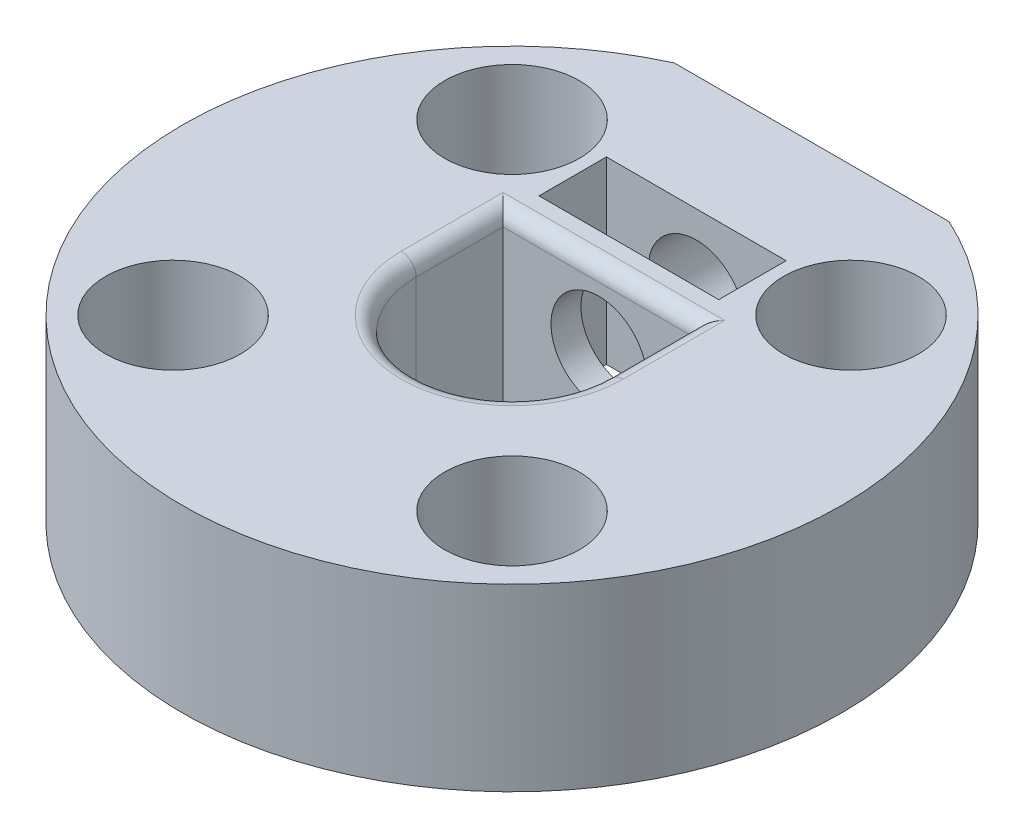
ISO-10303-21;
HEADER;
FILE_DESCRIPTION(('STEP AP214'),'2;1');
FILE_NAME('part.step','',(''),(''),'','','');
FILE_SCHEMA(('AUTOMOTIVE_DESIGN { 1 0 10303 214 1 1 1 1 }'));
ENDSEC;
DATA;
#1=APPLICATION_CONTEXT('core data for automotive mechanical design processes');
#2=APPLICATION_PROTOCOL_DEFINITION('international standard','automotive_design',2000,#1);
#3=PRODUCT_CONTEXT('',#1,'mechanical');
#4=PRODUCT('Part','Part','',(#3));
#5=PRODUCT_RELATED_PRODUCT_CATEGORY('part','',(#4));
#6=PRODUCT_DEFINITION_FORMATION('','',#4);
#7=PRODUCT_DEFINITION_CONTEXT('part definition',#1,'design');
#8=PRODUCT_DEFINITION('design','',#6,#7);
#9=PRODUCT_DEFINITION_SHAPE('','',#8);
#10=(LENGTH_UNIT() NAMED_UNIT(*) SI_UNIT(.MILLI.,.METRE.));
#11=(NAMED_UNIT(*) PLANE_ANGLE_UNIT() SI_UNIT($,.RADIAN.));
#12=(NAMED_UNIT(*) SI_UNIT($,.STERADIAN.) SOLID_ANGLE_UNIT());
#13=UNCERTAINTY_MEASURE_WITH_UNIT(LENGTH_MEASURE(1.E-05),#10,'distance_accuracy_value','');
#14=(GEOMETRIC_REPRESENTATION_CONTEXT(3) GLOBAL_UNCERTAINTY_ASSIGNED_CONTEXT((#13)) GLOBAL_UNIT_ASSIGNED_CONTEXT((#10,
#11,#12)) REPRESENTATION_CONTEXT('',''));
#15=CARTESIAN_POINT('',(0.,0.,0.));
#16=DIRECTION('',(0.,0.,1.));
#17=DIRECTION('',(1.,0.,0.));
#18=AXIS2_PLACEMENT_3D('',#15,#16,#17);
#19=CARTESIAN_POINT('',(0.,3.5,-10.));
#20=DIRECTION('',(0.,0.,1.));
#21=DIRECTION('',(1.,0.,0.));
#22=AXIS2_PLACEMENT_3D('',#19,#20,#21);
#23=CYLINDRICAL_SURFACE('',#22,1.6);
#24=CARTESIAN_POINT('',(0.,3.5,-3.9));
#25=DIRECTION('',(0.,0.,1.));
#26=DIRECTION('',(1.,0.,0.));
#27=AXIS2_PLACEMENT_3D('',#24,#25,#26);
#28=CIRCLE('',#27,1.6);
#29=CARTESIAN_POINT('',(1.6,3.5,-3.9));
#30=VERTEX_POINT('',#29);
#31=EDGE_CURVE('E44',#30,#30,#28,.F.);
#32=ORIENTED_EDGE('',*,*,#31,.T.);
#33=EDGE_LOOP('',(#32));
#34=FACE_BOUND('',#33,.T.);
#35=CARTESIAN_POINT('',(0.,3.5,-2.9));
#36=DIRECTION('',(0.,0.,1.));
#37=DIRECTION('',(1.,0.,0.));
#38=AXIS2_PLACEMENT_3D('',#35,#36,#37);
#39=CIRCLE('',#38,1.6);
#40=CARTESIAN_POINT('',(1.6,3.5,-2.9));
#41=VERTEX_POINT('',#40);
#42=EDGE_CURVE('E171',#41,#41,#39,.T.);
#43=ORIENTED_EDGE('',*,*,#42,.T.);
#44=EDGE_LOOP('',(#43));
#45=FACE_BOUND('',#44,.T.);
#46=ADVANCED_FACE('F40',(#34,#45),#23,.F.);
#47=CARTESIAN_POINT('',(0.,6.,0.));
#48=DIRECTION('',(0.,1.,0.));
#49=DIRECTION('',(0.,0.,1.));
#50=AXIS2_PLACEMENT_3D('',#47,#48,#49);
#51=PLANE('',#50);
#52=DIRECTION('',(0.,0.,-1.));
#53=VECTOR('',#52,1.);
#54=CARTESIAN_POINT('',(3.,6.,-3.9));
#55=LINE('',#54,#53);
#56=CARTESIAN_POINT('',(3.,6.,-3.9));
#57=VERTEX_POINT('',#56);
#58=CARTESIAN_POINT('',(3.,6.,-6.15));
#59=VERTEX_POINT('',#58);
#60=EDGE_CURVE('E57',#57,#59,#55,.T.);
#61=ORIENTED_EDGE('',*,*,#60,.F.);
#62=DIRECTION('',(1.,0.,0.));
#63=VECTOR('',#62,1.);
#64=CARTESIAN_POINT('',(-3.,6.,-3.9));
#65=LINE('',#64,#63);
#66=CARTESIAN_POINT('',(-3.,6.,-3.9));
#67=VERTEX_POINT('',#66);
#68=EDGE_CURVE('E149',#67,#57,#65,.T.);
#69=ORIENTED_EDGE('',*,*,#68,.F.);
#70=DIRECTION('',(0.,0.,1.));
#71=VECTOR('',#70,1.);
#72=CARTESIAN_POINT('',(-3.,6.,-3.9));
#73=LINE('',#72,#71);
#74=CARTESIAN_POINT('',(-3.,6.,-6.15));
#75=VERTEX_POINT('',#74);
#76=EDGE_CURVE('E152',#75,#67,#73,.T.);
#77=ORIENTED_EDGE('',*,*,#76,.F.);
#78=DIRECTION('',(-1.,0.,0.));
#79=VECTOR('',#78,1.);
#80=CARTESIAN_POINT('',(-3.,6.,-6.15));
#81=LINE('',#80,#79);
#82=EDGE_CURVE('E158',#59,#75,#81,.T.);
#83=ORIENTED_EDGE('',*,*,#82,.F.);
#84=EDGE_LOOP('',(#61,#69,#77,#83));
#85=FACE_BOUND('',#84,.T.);
#86=DIRECTION('',(0.,0.,1.));
#87=VECTOR('',#86,1.);
#88=CARTESIAN_POINT('',(-3.7,6.,0.));
#89=LINE('',#88,#87);
#90=CARTESIAN_POINT('',(-3.7,6.,0.));
#91=VERTEX_POINT('',#90);
#92=CARTESIAN_POINT('',(-3.7,6.,-3.4));
#93=VERTEX_POINT('',#92);
#94=EDGE_CURVE('E264',#91,#93,#89,.F.);
#95=ORIENTED_EDGE('',*,*,#94,.T.);
#96=DIRECTION('',(-1.,0.,0.));
#97=VECTOR('',#96,1.);
#98=CARTESIAN_POINT('',(0.,6.,-3.4));
#99=LINE('',#98,#97);
#100=CARTESIAN_POINT('',(3.7,6.,-3.4));
#101=VERTEX_POINT('',#100);
#102=EDGE_CURVE('E267',#93,#101,#99,.F.);
#103=ORIENTED_EDGE('',*,*,#102,.T.);
#104=DIRECTION('',(0.,0.,-1.));
#105=VECTOR('',#104,1.);
#106=CARTESIAN_POINT('',(3.7,6.,0.));
#107=LINE('',#106,#105);
#108=CARTESIAN_POINT('',(3.7,6.,0.));
#109=VERTEX_POINT('',#108);
#110=EDGE_CURVE('E262',#101,#109,#107,.F.);
#111=ORIENTED_EDGE('',*,*,#110,.T.);
#112=CARTESIAN_POINT('',(0.,6.,0.));
#113=DIRECTION('',(0.,1.,0.));
#114=DIRECTION('',(0.,0.,1.));
#115=AXIS2_PLACEMENT_3D('',#112,#113,#114);
#116=CIRCLE('',#115,3.7);
#117=EDGE_CURVE('E260',#109,#91,#116,.F.);
#118=ORIENTED_EDGE('',*,*,#117,.T.);
#119=EDGE_LOOP('',(#95,#103,#111,#118));
#120=FACE_BOUND('',#119,.T.);
#121=CARTESIAN_POINT('',(5.65685424949237,6.,-5.65685424949239));
#122=DIRECTION('',(0.,1.,0.));
#123=DIRECTION('',(0.,0.,1.));
#124=AXIS2_PLACEMENT_3D('',#121,#122,#123);
#125=CIRCLE('',#124,2.25);
#126=CARTESIAN_POINT('',(5.65685424949237,6.,-3.40685424949239));
#127=VERTEX_POINT('',#126);
#128=EDGE_CURVE('E172',#127,#127,#125,.T.);
#129=ORIENTED_EDGE('',*,*,#128,.F.);
#130=EDGE_LOOP('',(#129));
#131=FACE_BOUND('',#130,.T.);
#132=CARTESIAN_POINT('',(5.65685424949239,6.,5.65685424949237));
#133=DIRECTION('',(0.,1.,0.));
#134=DIRECTION('',(0.,0.,1.));
#135=AXIS2_PLACEMENT_3D('',#132,#133,#134);
#136=CIRCLE('',#135,2.25);
#137=CARTESIAN_POINT('',(5.65685424949239,6.,7.90685424949237));
#138=VERTEX_POINT('',#137);
#139=EDGE_CURVE('E185',#138,#138,#136,.T.);
#140=ORIENTED_EDGE('',*,*,#139,.F.);
#141=EDGE_LOOP('',(#140));
#142=FACE_BOUND('',#141,.T.);
#143=CARTESIAN_POINT('',(-5.65685424949237,6.,5.65685424949239));
#144=DIRECTION('',(0.,1.,0.));
#145=DIRECTION('',(0.,0.,1.));
#146=AXIS2_PLACEMENT_3D('',#143,#144,#145);
#147=CIRCLE('',#146,2.25);
#148=CARTESIAN_POINT('',(-5.65685424949237,6.,7.90685424949239));
#149=VERTEX_POINT('',#148);
#150=EDGE_CURVE('E197',#149,#149,#147,.T.);
#151=ORIENTED_EDGE('',*,*,#150,.F.);
#152=EDGE_LOOP('',(#151));
#153=FACE_BOUND('',#152,.T.);
#154=CARTESIAN_POINT('',(-5.65685424949239,6.,-5.65685424949237));
#155=DIRECTION('',(0.,1.,0.));
#156=DIRECTION('',(0.,0.,1.));
#157=AXIS2_PLACEMENT_3D('',#154,#155,#156);
#158=CIRCLE('',#157,2.25);
#159=CARTESIAN_POINT('',(-5.65685424949239,6.,-3.40685424949237));
#160=VERTEX_POINT('',#159);
#161=EDGE_CURVE('E209',#160,#160,#158,.T.);
#162=ORIENTED_EDGE('',*,*,#161,.F.);
#163=EDGE_LOOP('',(#162));
#164=FACE_BOUND('',#163,.T.);
#165=CARTESIAN_POINT('',(0.,6.,0.));
#166=DIRECTION('',(0.,1.,0.));
#167=DIRECTION('',(0.,0.,1.));
#168=AXIS2_PLACEMENT_3D('',#165,#166,#167);
#169=CIRCLE('',#168,11.);
#170=CARTESIAN_POINT('',(-4.58257569495584,6.,-10.));
#171=VERTEX_POINT('',#170);
#172=CARTESIAN_POINT('',(4.58257569495584,6.,-10.));
#173=VERTEX_POINT('',#172);
#174=EDGE_CURVE('E242',#171,#173,#169,.T.);
#175=ORIENTED_EDGE('',*,*,#174,.T.);
#176=DIRECTION('',(-1.,0.,0.));
#177=VECTOR('',#176,1.);
#178=CARTESIAN_POINT('',(4.58257569495584,6.,-10.));
#179=LINE('',#178,#177);
#180=EDGE_CURVE('E245',#173,#171,#179,.T.);
#181=ORIENTED_EDGE('',*,*,#180,.T.);
#182=EDGE_LOOP('',(#175,#181));
#183=FACE_BOUND('',#182,.T.);
#184=ADVANCED_FACE('F304',(#85,#120,#131,#142,#153,#164,#183),#51,.T.);
#185=CARTESIAN_POINT('',(0.,0.,0.));
#186=DIRECTION('',(0.,1.,0.));
#187=DIRECTION('',(0.,0.,1.));
#188=AXIS2_PLACEMENT_3D('',#185,#186,#187);
#189=PLANE('',#188);
#190=DIRECTION('',(1.,0.,0.));
#191=VECTOR('',#190,1.);
#192=CARTESIAN_POINT('',(-3.,0.,-3.9));
#193=LINE('',#192,#191);
#194=CARTESIAN_POINT('',(-3.,0.,-3.9));
#195=VERTEX_POINT('',#194);
#196=CARTESIAN_POINT('',(3.,0.,-3.9));
#197=VERTEX_POINT('',#196);
#198=EDGE_CURVE('E138',#195,#197,#193,.T.);
#199=ORIENTED_EDGE('',*,*,#198,.T.);
#200=DIRECTION('',(0.,0.,-1.));
#201=VECTOR('',#200,1.);
#202=CARTESIAN_POINT('',(3.,0.,-3.9));
#203=LINE('',#202,#201);
#204=CARTESIAN_POINT('',(3.,0.,-6.15));
#205=VERTEX_POINT('',#204);
#206=EDGE_CURVE('E132',#197,#205,#203,.T.);
#207=ORIENTED_EDGE('',*,*,#206,.T.);
#208=DIRECTION('',(-1.,0.,0.));
#209=VECTOR('',#208,1.);
#210=CARTESIAN_POINT('',(-3.,0.,-6.15));
#211=LINE('',#210,#209);
#212=CARTESIAN_POINT('',(-3.,0.,-6.15));
#213=VERTEX_POINT('',#212);
#214=EDGE_CURVE('E141',#205,#213,#211,.T.);
#215=ORIENTED_EDGE('',*,*,#214,.T.);
#216=DIRECTION('',(0.,0.,1.));
#217=VECTOR('',#216,1.);
#218=CARTESIAN_POINT('',(-3.,0.,-3.9));
#219=LINE('',#218,#217);
#220=EDGE_CURVE('E65',#213,#195,#219,.T.);
#221=ORIENTED_EDGE('',*,*,#220,.T.);
#222=EDGE_LOOP('',(#199,#207,#215,#221));
#223=FACE_BOUND('',#222,.T.);
#224=CARTESIAN_POINT('',(5.65685424949237,0.,-5.65685424949239));
#225=DIRECTION('',(0.,1.,0.));
#226=DIRECTION('',(0.,0.,1.));
#227=AXIS2_PLACEMENT_3D('',#224,#225,#226);
#228=CIRCLE('',#227,1.25);
#229=CARTESIAN_POINT('',(5.65685424949237,0.,-4.40685424949239));
#230=VERTEX_POINT('',#229);
#231=EDGE_CURVE('E182',#230,#230,#228,.T.);
#232=ORIENTED_EDGE('',*,*,#231,.T.);
#233=EDGE_LOOP('',(#232));
#234=FACE_BOUND('',#233,.T.);
#235=CARTESIAN_POINT('',(5.65685424949239,0.,5.65685424949237));
#236=DIRECTION('',(0.,1.,0.));
#237=DIRECTION('',(0.,0.,1.));
#238=AXIS2_PLACEMENT_3D('',#235,#236,#237);
#239=CIRCLE('',#238,1.25);
#240=CARTESIAN_POINT('',(5.65685424949239,0.,6.90685424949237));
#241=VERTEX_POINT('',#240);
#242=EDGE_CURVE('E194',#241,#241,#239,.T.);
#243=ORIENTED_EDGE('',*,*,#242,.T.);
#244=EDGE_LOOP('',(#243));
#245=FACE_BOUND('',#244,.T.);
#246=CARTESIAN_POINT('',(-5.65685424949237,0.,5.65685424949239));
#247=DIRECTION('',(0.,1.,0.));
#248=DIRECTION('',(0.,0.,1.));
#249=AXIS2_PLACEMENT_3D('',#246,#247,#248);
#250=CIRCLE('',#249,1.25);
#251=CARTESIAN_POINT('',(-5.65685424949237,0.,6.90685424949239));
#252=VERTEX_POINT('',#251);
#253=EDGE_CURVE('E206',#252,#252,#250,.T.);
#254=ORIENTED_EDGE('',*,*,#253,.T.);
#255=EDGE_LOOP('',(#254));
#256=FACE_BOUND('',#255,.T.);
#257=CARTESIAN_POINT('',(-5.65685424949239,0.,-5.65685424949237));
#258=DIRECTION('',(0.,1.,0.));
#259=DIRECTION('',(0.,0.,1.));
#260=AXIS2_PLACEMENT_3D('',#257,#258,#259);
#261=CIRCLE('',#260,1.25);
#262=CARTESIAN_POINT('',(-5.65685424949239,0.,-4.40685424949237));
#263=VERTEX_POINT('',#262);
#264=EDGE_CURVE('E218',#263,#263,#261,.T.);
#265=ORIENTED_EDGE('',*,*,#264,.T.);
#266=EDGE_LOOP('',(#265));
#267=FACE_BOUND('',#266,.T.);
#268=CARTESIAN_POINT('',(0.,0.,0.));
#269=DIRECTION('',(0.,1.,0.));
#270=DIRECTION('',(0.,0.,1.));
#271=AXIS2_PLACEMENT_3D('',#268,#269,#270);
#272=CIRCLE('',#271,11.);
#273=CARTESIAN_POINT('',(-4.58257569495584,0.,-10.));
#274=VERTEX_POINT('',#273);
#275=CARTESIAN_POINT('',(4.58257569495584,0.,-10.));
#276=VERTEX_POINT('',#275);
#277=EDGE_CURVE('E241',#274,#276,#272,.T.);
#278=ORIENTED_EDGE('',*,*,#277,.F.);
#279=DIRECTION('',(-1.,0.,0.));
#280=VECTOR('',#279,1.);
#281=CARTESIAN_POINT('',(4.58257569495584,0.,-10.));
#282=LINE('',#281,#280);
#283=EDGE_CURVE('E246',#276,#274,#282,.T.);
#284=ORIENTED_EDGE('',*,*,#283,.F.);
#285=EDGE_LOOP('',(#278,#284));
#286=FACE_BOUND('',#285,.T.);
#287=CARTESIAN_POINT('',(0.,0.,0.));
#288=DIRECTION('',(0.,1.,0.));
#289=DIRECTION('',(0.,0.,1.));
#290=AXIS2_PLACEMENT_3D('',#287,#288,#289);
#291=CIRCLE('',#290,3.2);
#292=CARTESIAN_POINT('',(-3.2,0.,0.));
#293=VERTEX_POINT('',#292);
#294=CARTESIAN_POINT('',(3.2,0.,0.));
#295=VERTEX_POINT('',#294);
#296=EDGE_CURVE('E221',#293,#295,#291,.T.);
#297=ORIENTED_EDGE('',*,*,#296,.T.);
#298=DIRECTION('',(0.,0.,-1.));
#299=VECTOR('',#298,1.);
#300=CARTESIAN_POINT('',(3.2,0.,0.));
#301=LINE('',#300,#299);
#302=CARTESIAN_POINT('',(3.2,0.,-2.9));
#303=VERTEX_POINT('',#302);
#304=EDGE_CURVE('E224',#295,#303,#301,.T.);
#305=ORIENTED_EDGE('',*,*,#304,.T.);
#306=DIRECTION('',(-1.,0.,0.));
#307=VECTOR('',#306,1.);
#308=CARTESIAN_POINT('',(3.2,0.,-2.9));
#309=LINE('',#308,#307);
#310=CARTESIAN_POINT('',(-3.2,0.,-2.9));
#311=VERTEX_POINT('',#310);
#312=EDGE_CURVE('E227',#303,#311,#309,.T.);
#313=ORIENTED_EDGE('',*,*,#312,.T.);
#314=DIRECTION('',(0.,0.,1.));
#315=VECTOR('',#314,1.);
#316=CARTESIAN_POINT('',(-3.2,0.,0.));
#317=LINE('',#316,#315);
#318=EDGE_CURVE('E230',#311,#293,#317,.T.);
#319=ORIENTED_EDGE('',*,*,#318,.T.);
#320=EDGE_LOOP('',(#297,#305,#313,#319));
#321=FACE_BOUND('',#320,.T.);
#322=ADVANCED_FACE('F146',(#223,#234,#245,#256,#267,#286,#321),#189,.F.);
#323=CARTESIAN_POINT('',(0.,6.,0.));
#324=DIRECTION('',(0.,-1.,0.));
#325=DIRECTION('',(0.,0.,-1.));
#326=AXIS2_PLACEMENT_3D('',#323,#324,#325);
#327=CYLINDRICAL_SURFACE('',#326,11.);
#328=ORIENTED_EDGE('',*,*,#277,.T.);
#329=DIRECTION('',(0.,-1.,0.));
#330=VECTOR('',#329,1.);
#331=CARTESIAN_POINT('',(4.58257569495584,6.,-10.));
#332=LINE('',#331,#330);
#333=EDGE_CURVE('E254',#173,#276,#332,.T.);
#334=ORIENTED_EDGE('',*,*,#333,.F.);
#335=ORIENTED_EDGE('',*,*,#174,.F.);
#336=DIRECTION('',(0.,-1.,0.));
#337=VECTOR('',#336,1.);
#338=CARTESIAN_POINT('',(-4.58257569495584,6.,-10.));
#339=LINE('',#338,#337);
#340=EDGE_CURVE('E248',#171,#274,#339,.T.);
#341=ORIENTED_EDGE('',*,*,#340,.T.);
#342=EDGE_LOOP('',(#328,#334,#335,#341));
#343=FACE_BOUND('',#342,.T.);
#344=ADVANCED_FACE('F379',(#343),#327,.T.);
#345=CARTESIAN_POINT('',(4.58257569495584,6.,-10.));
#346=DIRECTION('',(0.,0.,1.));
#347=DIRECTION('',(1.,0.,0.));
#348=AXIS2_PLACEMENT_3D('',#345,#346,#347);
#349=PLANE('',#348);
#350=CARTESIAN_POINT('',(0.,3.5,-10.));
#351=DIRECTION('',(0.,0.,1.));
#352=DIRECTION('',(1.,0.,0.));
#353=AXIS2_PLACEMENT_3D('',#350,#351,#352);
#354=CIRCLE('',#353,1.6);
#355=CARTESIAN_POINT('',(1.6,3.5,-10.));
#356=VERTEX_POINT('',#355);
#357=EDGE_CURVE('E168',#356,#356,#354,.T.);
#358=ORIENTED_EDGE('',*,*,#357,.T.);
#359=EDGE_LOOP('',(#358));
#360=FACE_BOUND('',#359,.T.);
#361=ORIENTED_EDGE('',*,*,#283,.T.);
#362=ORIENTED_EDGE('',*,*,#340,.F.);
#363=ORIENTED_EDGE('',*,*,#180,.F.);
#364=ORIENTED_EDGE('',*,*,#333,.T.);
#365=EDGE_LOOP('',(#361,#362,#363,#364));
#366=FACE_BOUND('',#365,.T.);
#367=ADVANCED_FACE('F374',(#360,#366),#349,.F.);
#368=CARTESIAN_POINT('',(0.,6.,0.));
#369=DIRECTION('',(0.,-1.,0.));
#370=DIRECTION('',(0.,0.,-1.));
#371=AXIS2_PLACEMENT_3D('',#368,#369,#370);
#372=CYLINDRICAL_SURFACE('',#371,3.2);
#373=DIRECTION('',(0.,-1.,0.));
#374=VECTOR('',#373,1.);
#375=CARTESIAN_POINT('',(-3.2,6.,0.));
#376=LINE('',#375,#374);
#377=CARTESIAN_POINT('',(-3.2,5.5,0.));
#378=VERTEX_POINT('',#377);
#379=EDGE_CURVE('E233',#378,#293,#376,.T.);
#380=ORIENTED_EDGE('',*,*,#379,.F.);
#381=CARTESIAN_POINT('',(0.,5.5,0.));
#382=DIRECTION('',(0.,1.,0.));
#383=DIRECTION('',(0.,0.,1.));
#384=AXIS2_PLACEMENT_3D('',#381,#382,#383);
#385=CIRCLE('',#384,3.2);
#386=CARTESIAN_POINT('',(3.2,5.5,0.));
#387=VERTEX_POINT('',#386);
#388=EDGE_CURVE('E11',#378,#387,#385,.T.);
#389=ORIENTED_EDGE('',*,*,#388,.T.);
#390=DIRECTION('',(0.,-1.,0.));
#391=VECTOR('',#390,1.);
#392=CARTESIAN_POINT('',(3.2,6.,0.));
#393=LINE('',#392,#391);
#394=EDGE_CURVE('E239',#387,#295,#393,.T.);
#395=ORIENTED_EDGE('',*,*,#394,.T.);
#396=ORIENTED_EDGE('',*,*,#296,.F.);
#397=EDGE_LOOP('',(#380,#389,#395,#396));
#398=FACE_BOUND('',#397,.T.);
#399=ADVANCED_FACE('F371',(#398),#372,.F.);
#400=CARTESIAN_POINT('',(3.2,6.,0.));
#401=DIRECTION('',(-1.,0.,0.));
#402=DIRECTION('',(0.,0.,1.));
#403=AXIS2_PLACEMENT_3D('',#400,#401,#402);
#404=PLANE('',#403);
#405=ORIENTED_EDGE('',*,*,#394,.F.);
#406=DIRECTION('',(0.,0.,-1.));
#407=VECTOR('',#406,1.);
#408=CARTESIAN_POINT('',(3.2,5.5,0.));
#409=LINE('',#408,#407);
#410=CARTESIAN_POINT('',(3.2,5.5,-2.9));
#411=VERTEX_POINT('',#410);
#412=EDGE_CURVE('E269',#387,#411,#409,.T.);
#413=ORIENTED_EDGE('',*,*,#412,.T.);
#414=DIRECTION('',(0.,-1.,0.));
#415=VECTOR('',#414,1.);
#416=CARTESIAN_POINT('',(3.2,6.,-2.9));
#417=LINE('',#416,#415);
#418=EDGE_CURVE('E237',#411,#303,#417,.T.);
#419=ORIENTED_EDGE('',*,*,#418,.T.);
#420=ORIENTED_EDGE('',*,*,#304,.F.);
#421=EDGE_LOOP('',(#405,#413,#419,#420));
#422=FACE_BOUND('',#421,.T.);
#423=ADVANCED_FACE('F367',(#422),#404,.T.);
#424=CARTESIAN_POINT('',(3.2,6.,-2.9));
#425=DIRECTION('',(0.,0.,1.));
#426=DIRECTION('',(1.,0.,0.));
#427=AXIS2_PLACEMENT_3D('',#424,#425,#426);
#428=PLANE('',#427);
#429=ORIENTED_EDGE('',*,*,#42,.F.);
#430=EDGE_LOOP('',(#429));
#431=FACE_BOUND('',#430,.T.);
#432=ORIENTED_EDGE('',*,*,#418,.F.);
#433=DIRECTION('',(-1.,0.,0.));
#434=VECTOR('',#433,1.);
#435=CARTESIAN_POINT('',(3.2,5.5,-2.9));
#436=LINE('',#435,#434);
#437=CARTESIAN_POINT('',(-3.2,5.5,-2.9));
#438=VERTEX_POINT('',#437);
#439=EDGE_CURVE('E49',#411,#438,#436,.T.);
#440=ORIENTED_EDGE('',*,*,#439,.T.);
#441=DIRECTION('',(0.,-1.,0.));
#442=VECTOR('',#441,1.);
#443=CARTESIAN_POINT('',(-3.2,6.,-2.9));
#444=LINE('',#443,#442);
#445=EDGE_CURVE('E235',#438,#311,#444,.T.);
#446=ORIENTED_EDGE('',*,*,#445,.T.);
#447=ORIENTED_EDGE('',*,*,#312,.F.);
#448=EDGE_LOOP('',(#432,#440,#446,#447));
#449=FACE_BOUND('',#448,.T.);
#450=ADVANCED_FACE('F363',(#431,#449),#428,.T.);
#451=CARTESIAN_POINT('',(-3.2,6.,0.));
#452=DIRECTION('',(1.,0.,0.));
#453=DIRECTION('',(0.,0.,-1.));
#454=AXIS2_PLACEMENT_3D('',#451,#452,#453);
#455=PLANE('',#454);
#456=ORIENTED_EDGE('',*,*,#445,.F.);
#457=DIRECTION('',(0.,0.,1.));
#458=VECTOR('',#457,1.);
#459=CARTESIAN_POINT('',(-3.2,5.5,0.));
#460=LINE('',#459,#458);
#461=EDGE_CURVE('E257',#438,#378,#460,.T.);
#462=ORIENTED_EDGE('',*,*,#461,.T.);
#463=ORIENTED_EDGE('',*,*,#379,.T.);
#464=ORIENTED_EDGE('',*,*,#318,.F.);
#465=EDGE_LOOP('',(#456,#462,#463,#464));
#466=FACE_BOUND('',#465,.T.);
#467=ADVANCED_FACE('F359',(#466),#455,.T.);
#468=CARTESIAN_POINT('',(-5.65685424949239,6.,-5.65685424949237));
#469=DIRECTION('',(0.,1.,0.));
#470=DIRECTION('',(0.,0.,1.));
#471=AXIS2_PLACEMENT_3D('',#468,#469,#470);
#472=CYLINDRICAL_SURFACE('',#471,1.25);
#473=ORIENTED_EDGE('',*,*,#264,.F.);
#474=EDGE_LOOP('',(#473));
#475=FACE_BOUND('',#474,.T.);
#476=CARTESIAN_POINT('',(-5.65685424949239,1.5,-5.65685424949237));
#477=DIRECTION('',(0.,1.,0.));
#478=DIRECTION('',(0.,0.,1.));
#479=AXIS2_PLACEMENT_3D('',#476,#477,#478);
#480=CIRCLE('',#479,1.25);
#481=CARTESIAN_POINT('',(-5.65685424949239,1.5,-4.40685424949237));
#482=VERTEX_POINT('',#481);
#483=EDGE_CURVE('E215',#482,#482,#480,.T.);
#484=ORIENTED_EDGE('',*,*,#483,.T.);
#485=EDGE_LOOP('',(#484));
#486=FACE_BOUND('',#485,.T.);
#487=ADVANCED_FACE('F355',(#475,#486),#472,.F.);
#488=CARTESIAN_POINT('',(-4.40685424949239,1.5,-5.65685424949237));
#489=DIRECTION('',(0.,-1.,0.));
#490=DIRECTION('',(0.,0.,-1.));
#491=AXIS2_PLACEMENT_3D('',#488,#489,#490);
#492=PLANE('',#491);
#493=ORIENTED_EDGE('',*,*,#483,.F.);
#494=EDGE_LOOP('',(#493));
#495=FACE_BOUND('',#494,.T.);
#496=CARTESIAN_POINT('',(-5.65685424949239,1.5,-5.65685424949237));
#497=DIRECTION('',(0.,1.,0.));
#498=DIRECTION('',(0.,0.,1.));
#499=AXIS2_PLACEMENT_3D('',#496,#497,#498);
#500=CIRCLE('',#499,2.25);
#501=CARTESIAN_POINT('',(-5.65685424949239,1.5,-3.40685424949237));
#502=VERTEX_POINT('',#501);
#503=EDGE_CURVE('E212',#502,#502,#500,.T.);
#504=ORIENTED_EDGE('',*,*,#503,.T.);
#505=EDGE_LOOP('',(#504));
#506=FACE_BOUND('',#505,.T.);
#507=ADVANCED_FACE('F351',(#495,#506),#492,.F.);
#508=CARTESIAN_POINT('',(-5.65685424949239,6.,-5.65685424949237));
#509=DIRECTION('',(0.,1.,0.));
#510=DIRECTION('',(0.,0.,1.));
#511=AXIS2_PLACEMENT_3D('',#508,#509,#510);
#512=CYLINDRICAL_SURFACE('',#511,2.25);
#513=ORIENTED_EDGE('',*,*,#503,.F.);
#514=EDGE_LOOP('',(#513));
#515=FACE_BOUND('',#514,.T.);
#516=ORIENTED_EDGE('',*,*,#161,.T.);
#517=EDGE_LOOP('',(#516));
#518=FACE_BOUND('',#517,.T.);
#519=ADVANCED_FACE('F347',(#515,#518),#512,.F.);
#520=CARTESIAN_POINT('',(-5.65685424949237,6.,5.65685424949239));
#521=DIRECTION('',(0.,1.,0.));
#522=DIRECTION('',(0.,0.,1.));
#523=AXIS2_PLACEMENT_3D('',#520,#521,#522);
#524=CYLINDRICAL_SURFACE('',#523,1.25);
#525=ORIENTED_EDGE('',*,*,#253,.F.);
#526=EDGE_LOOP('',(#525));
#527=FACE_BOUND('',#526,.T.);
#528=CARTESIAN_POINT('',(-5.65685424949237,1.5,5.65685424949239));
#529=DIRECTION('',(0.,1.,0.));
#530=DIRECTION('',(0.,0.,1.));
#531=AXIS2_PLACEMENT_3D('',#528,#529,#530);
#532=CIRCLE('',#531,1.25);
#533=CARTESIAN_POINT('',(-5.65685424949237,1.5,6.90685424949239));
#534=VERTEX_POINT('',#533);
#535=EDGE_CURVE('E203',#534,#534,#532,.T.);
#536=ORIENTED_EDGE('',*,*,#535,.T.);
#537=EDGE_LOOP('',(#536));
#538=FACE_BOUND('',#537,.T.);
#539=ADVANCED_FACE('F343',(#527,#538),#524,.F.);
#540=CARTESIAN_POINT('',(-4.40685424949237,1.5,5.65685424949239));
#541=DIRECTION('',(0.,-1.,0.));
#542=DIRECTION('',(0.,0.,-1.));
#543=AXIS2_PLACEMENT_3D('',#540,#541,#542);
#544=PLANE('',#543);
#545=ORIENTED_EDGE('',*,*,#535,.F.);
#546=EDGE_LOOP('',(#545));
#547=FACE_BOUND('',#546,.T.);
#548=CARTESIAN_POINT('',(-5.65685424949237,1.5,5.65685424949239));
#549=DIRECTION('',(0.,1.,0.));
#550=DIRECTION('',(0.,0.,1.));
#551=AXIS2_PLACEMENT_3D('',#548,#549,#550);
#552=CIRCLE('',#551,2.25);
#553=CARTESIAN_POINT('',(-5.65685424949237,1.5,7.90685424949239));
#554=VERTEX_POINT('',#553);
#555=EDGE_CURVE('E200',#554,#554,#552,.T.);
#556=ORIENTED_EDGE('',*,*,#555,.T.);
#557=EDGE_LOOP('',(#556));
#558=FACE_BOUND('',#557,.T.);
#559=ADVANCED_FACE('F339',(#547,#558),#544,.F.);
#560=CARTESIAN_POINT('',(-5.65685424949237,6.,5.65685424949239));
#561=DIRECTION('',(0.,1.,0.));
#562=DIRECTION('',(0.,0.,1.));
#563=AXIS2_PLACEMENT_3D('',#560,#561,#562);
#564=CYLINDRICAL_SURFACE('',#563,2.25);
#565=ORIENTED_EDGE('',*,*,#555,.F.);
#566=EDGE_LOOP('',(#565));
#567=FACE_BOUND('',#566,.T.);
#568=ORIENTED_EDGE('',*,*,#150,.T.);
#569=EDGE_LOOP('',(#568));
#570=FACE_BOUND('',#569,.T.);
#571=ADVANCED_FACE('F335',(#567,#570),#564,.F.);
#572=CARTESIAN_POINT('',(5.65685424949239,6.,5.65685424949237));
#573=DIRECTION('',(0.,1.,0.));
#574=DIRECTION('',(0.,0.,1.));
#575=AXIS2_PLACEMENT_3D('',#572,#573,#574);
#576=CYLINDRICAL_SURFACE('',#575,1.25);
#577=ORIENTED_EDGE('',*,*,#242,.F.);
#578=EDGE_LOOP('',(#577));
#579=FACE_BOUND('',#578,.T.);
#580=CARTESIAN_POINT('',(5.65685424949239,1.5,5.65685424949237));
#581=DIRECTION('',(0.,1.,0.));
#582=DIRECTION('',(0.,0.,1.));
#583=AXIS2_PLACEMENT_3D('',#580,#581,#582);
#584=CIRCLE('',#583,1.25);
#585=CARTESIAN_POINT('',(5.65685424949239,1.5,6.90685424949237));
#586=VERTEX_POINT('',#585);
#587=EDGE_CURVE('E191',#586,#586,#584,.T.);
#588=ORIENTED_EDGE('',*,*,#587,.T.);
#589=EDGE_LOOP('',(#588));
#590=FACE_BOUND('',#589,.T.);
#591=ADVANCED_FACE('F331',(#579,#590),#576,.F.);
#592=CARTESIAN_POINT('',(6.90685424949239,1.5,5.65685424949237));
#593=DIRECTION('',(0.,-1.,0.));
#594=DIRECTION('',(0.,0.,-1.));
#595=AXIS2_PLACEMENT_3D('',#592,#593,#594);
#596=PLANE('',#595);
#597=ORIENTED_EDGE('',*,*,#587,.F.);
#598=EDGE_LOOP('',(#597));
#599=FACE_BOUND('',#598,.T.);
#600=CARTESIAN_POINT('',(5.65685424949239,1.5,5.65685424949237));
#601=DIRECTION('',(0.,1.,0.));
#602=DIRECTION('',(0.,0.,1.));
#603=AXIS2_PLACEMENT_3D('',#600,#601,#602);
#604=CIRCLE('',#603,2.25);
#605=CARTESIAN_POINT('',(5.65685424949239,1.5,7.90685424949237));
#606=VERTEX_POINT('',#605);
#607=EDGE_CURVE('E188',#606,#606,#604,.T.);
#608=ORIENTED_EDGE('',*,*,#607,.T.);
#609=EDGE_LOOP('',(#608));
#610=FACE_BOUND('',#609,.T.);
#611=ADVANCED_FACE('F327',(#599,#610),#596,.F.);
#612=CARTESIAN_POINT('',(5.65685424949239,6.,5.65685424949237));
#613=DIRECTION('',(0.,1.,0.));
#614=DIRECTION('',(0.,0.,1.));
#615=AXIS2_PLACEMENT_3D('',#612,#613,#614);
#616=CYLINDRICAL_SURFACE('',#615,2.25);
#617=ORIENTED_EDGE('',*,*,#607,.F.);
#618=EDGE_LOOP('',(#617));
#619=FACE_BOUND('',#618,.T.);
#620=ORIENTED_EDGE('',*,*,#139,.T.);
#621=EDGE_LOOP('',(#620));
#622=FACE_BOUND('',#621,.T.);
#623=ADVANCED_FACE('F323',(#619,#622),#616,.F.);
#624=CARTESIAN_POINT('',(5.65685424949237,6.,-5.65685424949239));
#625=DIRECTION('',(0.,1.,0.));
#626=DIRECTION('',(0.,0.,1.));
#627=AXIS2_PLACEMENT_3D('',#624,#625,#626);
#628=CYLINDRICAL_SURFACE('',#627,1.25);
#629=ORIENTED_EDGE('',*,*,#231,.F.);
#630=EDGE_LOOP('',(#629));
#631=FACE_BOUND('',#630,.T.);
#632=CARTESIAN_POINT('',(5.65685424949237,1.5,-5.65685424949239));
#633=DIRECTION('',(0.,1.,0.));
#634=DIRECTION('',(0.,0.,1.));
#635=AXIS2_PLACEMENT_3D('',#632,#633,#634);
#636=CIRCLE('',#635,1.25);
#637=CARTESIAN_POINT('',(5.65685424949237,1.5,-4.40685424949239));
#638=VERTEX_POINT('',#637);
#639=EDGE_CURVE('E179',#638,#638,#636,.T.);
#640=ORIENTED_EDGE('',*,*,#639,.T.);
#641=EDGE_LOOP('',(#640));
#642=FACE_BOUND('',#641,.T.);
#643=ADVANCED_FACE('F319',(#631,#642),#628,.F.);
#644=CARTESIAN_POINT('',(6.90685424949237,1.5,-5.65685424949239));
#645=DIRECTION('',(0.,-1.,0.));
#646=DIRECTION('',(0.,0.,-1.));
#647=AXIS2_PLACEMENT_3D('',#644,#645,#646);
#648=PLANE('',#647);
#649=ORIENTED_EDGE('',*,*,#639,.F.);
#650=EDGE_LOOP('',(#649));
#651=FACE_BOUND('',#650,.T.);
#652=CARTESIAN_POINT('',(5.65685424949237,1.5,-5.65685424949239));
#653=DIRECTION('',(0.,1.,0.));
#654=DIRECTION('',(0.,0.,1.));
#655=AXIS2_PLACEMENT_3D('',#652,#653,#654);
#656=CIRCLE('',#655,2.25);
#657=CARTESIAN_POINT('',(5.65685424949237,1.5,-3.40685424949239));
#658=VERTEX_POINT('',#657);
#659=EDGE_CURVE('E175',#658,#658,#656,.T.);
#660=ORIENTED_EDGE('',*,*,#659,.T.);
#661=EDGE_LOOP('',(#660));
#662=FACE_BOUND('',#661,.T.);
#663=ADVANCED_FACE('F315',(#651,#662),#648,.F.);
#664=CARTESIAN_POINT('',(5.65685424949237,6.,-5.65685424949239));
#665=DIRECTION('',(0.,1.,0.));
#666=DIRECTION('',(0.,0.,1.));
#667=AXIS2_PLACEMENT_3D('',#664,#665,#666);
#668=CYLINDRICAL_SURFACE('',#667,2.25);
#669=ORIENTED_EDGE('',*,*,#659,.F.);
#670=EDGE_LOOP('',(#669));
#671=FACE_BOUND('',#670,.T.);
#672=ORIENTED_EDGE('',*,*,#128,.T.);
#673=EDGE_LOOP('',(#672));
#674=FACE_BOUND('',#673,.T.);
#675=ADVANCED_FACE('F312',(#671,#674),#668,.F.);
#676=CARTESIAN_POINT('',(3.7,5.5,0.));
#677=DIRECTION('',(0.,0.,-1.));
#678=DIRECTION('',(-1.,0.,0.));
#679=AXIS2_PLACEMENT_3D('',#676,#677,#678);
#680=CYLINDRICAL_SURFACE('',#679,0.5);
#681=CARTESIAN_POINT('',(3.7,5.5,0.));
#682=DIRECTION('',(0.,0.,1.));
#683=DIRECTION('',(1.,0.,0.));
#684=AXIS2_PLACEMENT_3D('',#681,#682,#683);
#685=CIRCLE('',#684,0.5);
#686=EDGE_CURVE('E276',#109,#387,#685,.T.);
#687=ORIENTED_EDGE('',*,*,#686,.F.);
#688=ORIENTED_EDGE('',*,*,#110,.F.);
#689=CARTESIAN_POINT('',(3.7,5.5,-3.4));
#690=DIRECTION('',(-0.707106781186548,0.,-0.707106781186547));
#691=DIRECTION('',(0.707106781186547,0.,-0.707106781186548));
#692=AXIS2_PLACEMENT_3D('',#689,#690,#691);
#693=ELLIPSE('',#692,0.707106781186547,0.5);
#694=EDGE_CURVE('E176',#411,#101,#693,.T.);
#695=ORIENTED_EDGE('',*,*,#694,.F.);
#696=ORIENTED_EDGE('',*,*,#412,.F.);
#697=EDGE_LOOP('',(#687,#688,#695,#696));
#698=FACE_BOUND('',#697,.T.);
#699=ADVANCED_FACE('F42',(#698),#680,.T.);
#700=CARTESIAN_POINT('',(3.2,5.5,-3.4));
#701=DIRECTION('',(-1.,0.,0.));
#702=DIRECTION('',(0.,0.,1.));
#703=AXIS2_PLACEMENT_3D('',#700,#701,#702);
#704=CYLINDRICAL_SURFACE('',#703,0.5);
#705=ORIENTED_EDGE('',*,*,#694,.T.);
#706=ORIENTED_EDGE('',*,*,#102,.F.);
#707=CARTESIAN_POINT('',(-3.7,5.5,-3.4));
#708=DIRECTION('',(-0.707106781186548,0.,0.707106781186547));
#709=DIRECTION('',(0.707106781186547,0.,0.707106781186548));
#710=AXIS2_PLACEMENT_3D('',#707,#708,#709);
#711=ELLIPSE('',#710,0.707106781186547,0.5);
#712=EDGE_CURVE('E274',#438,#93,#711,.T.);
#713=ORIENTED_EDGE('',*,*,#712,.F.);
#714=ORIENTED_EDGE('',*,*,#439,.F.);
#715=EDGE_LOOP('',(#705,#706,#713,#714));
#716=FACE_BOUND('',#715,.T.);
#717=ADVANCED_FACE('F391',(#716),#704,.T.);
#718=CARTESIAN_POINT('',(0.,5.5,0.));
#719=DIRECTION('',(0.,1.,0.));
#720=DIRECTION('',(0.,0.,1.));
#721=AXIS2_PLACEMENT_3D('',#718,#719,#720);
#722=TOROIDAL_SURFACE('',#721,3.7,0.5);
#723=ORIENTED_EDGE('',*,*,#686,.T.);
#724=ORIENTED_EDGE('',*,*,#388,.F.);
#725=CARTESIAN_POINT('',(-3.7,5.5,0.));
#726=DIRECTION('',(0.,0.,-1.));
#727=DIRECTION('',(-1.,0.,0.));
#728=AXIS2_PLACEMENT_3D('',#725,#726,#727);
#729=CIRCLE('',#728,0.5);
#730=EDGE_CURVE('E272',#91,#378,#729,.T.);
#731=ORIENTED_EDGE('',*,*,#730,.F.);
#732=ORIENTED_EDGE('',*,*,#117,.F.);
#733=EDGE_LOOP('',(#723,#724,#731,#732));
#734=FACE_BOUND('',#733,.T.);
#735=ADVANCED_FACE('F388',(#734),#722,.T.);
#736=CARTESIAN_POINT('',(-3.7,5.5,0.));
#737=DIRECTION('',(0.,0.,1.));
#738=DIRECTION('',(1.,0.,0.));
#739=AXIS2_PLACEMENT_3D('',#736,#737,#738);
#740=CYLINDRICAL_SURFACE('',#739,0.5);
#741=ORIENTED_EDGE('',*,*,#712,.T.);
#742=ORIENTED_EDGE('',*,*,#94,.F.);
#743=ORIENTED_EDGE('',*,*,#730,.T.);
#744=ORIENTED_EDGE('',*,*,#461,.F.);
#745=EDGE_LOOP('',(#741,#742,#743,#744));
#746=FACE_BOUND('',#745,.T.);
#747=ADVANCED_FACE('F300',(#746),#740,.T.);
#748=CARTESIAN_POINT('',(0.,3.5,-6.15));
#749=DIRECTION('',(0.,0.,-1.));
#750=DIRECTION('',(-1.,0.,0.));
#751=AXIS2_PLACEMENT_3D('',#748,#749,#750);
#752=CIRCLE('',#751,1.6);
#753=CARTESIAN_POINT('',(-1.6,3.5,-6.15));
#754=VERTEX_POINT('',#753);
#755=EDGE_CURVE('E164',#754,#754,#752,.F.);
#756=ORIENTED_EDGE('',*,*,#755,.T.);
#757=EDGE_LOOP('',(#756));
#758=FACE_BOUND('',#757,.T.);
#759=ORIENTED_EDGE('',*,*,#357,.F.);
#760=EDGE_LOOP('',(#759));
#761=FACE_BOUND('',#760,.T.);
#762=ADVANCED_FACE('F292',(#758,#761),#23,.F.);
#763=CARTESIAN_POINT('',(-3.,0.,-3.9));
#764=DIRECTION('',(0.,0.,1.));
#765=DIRECTION('',(1.,0.,0.));
#766=AXIS2_PLACEMENT_3D('',#763,#764,#765);
#767=PLANE('',#766);
#768=ORIENTED_EDGE('',*,*,#68,.T.);
#769=DIRECTION('',(0.,1.,0.));
#770=VECTOR('',#769,1.);
#771=CARTESIAN_POINT('',(3.,0.,-3.9));
#772=LINE('',#771,#770);
#773=EDGE_CURVE('E162',#197,#57,#772,.T.);
#774=ORIENTED_EDGE('',*,*,#773,.F.);
#775=ORIENTED_EDGE('',*,*,#198,.F.);
#776=DIRECTION('',(0.,1.,0.));
#777=VECTOR('',#776,1.);
#778=CARTESIAN_POINT('',(-3.,0.,-3.9));
#779=LINE('',#778,#777);
#780=EDGE_CURVE('E165',#195,#67,#779,.T.);
#781=ORIENTED_EDGE('',*,*,#780,.T.);
#782=EDGE_LOOP('',(#768,#774,#775,#781));
#783=FACE_BOUND('',#782,.T.);
#784=ORIENTED_EDGE('',*,*,#31,.F.);
#785=EDGE_LOOP('',(#784));
#786=FACE_BOUND('',#785,.T.);
#787=ADVANCED_FACE('F290',(#783,#786),#767,.F.);
#788=CARTESIAN_POINT('',(-3.,0.,-6.15));
#789=DIRECTION('',(0.,0.,-1.));
#790=DIRECTION('',(-1.,0.,0.));
#791=AXIS2_PLACEMENT_3D('',#788,#789,#790);
#792=PLANE('',#791);
#793=ORIENTED_EDGE('',*,*,#82,.T.);
#794=DIRECTION('',(0.,1.,0.));
#795=VECTOR('',#794,1.);
#796=CARTESIAN_POINT('',(-3.,0.,-6.15));
#797=LINE('',#796,#795);
#798=EDGE_CURVE('E137',#213,#75,#797,.T.);
#799=ORIENTED_EDGE('',*,*,#798,.F.);
#800=ORIENTED_EDGE('',*,*,#214,.F.);
#801=DIRECTION('',(0.,1.,0.));
#802=VECTOR('',#801,1.);
#803=CARTESIAN_POINT('',(3.,0.,-6.15));
#804=LINE('',#803,#802);
#805=EDGE_CURVE('E128',#205,#59,#804,.T.);
#806=ORIENTED_EDGE('',*,*,#805,.T.);
#807=EDGE_LOOP('',(#793,#799,#800,#806));
#808=FACE_BOUND('',#807,.T.);
#809=ORIENTED_EDGE('',*,*,#755,.F.);
#810=EDGE_LOOP('',(#809));
#811=FACE_BOUND('',#810,.T.);
#812=ADVANCED_FACE('F142',(#808,#811),#792,.F.);
#813=CARTESIAN_POINT('',(3.,0.,-3.9));
#814=DIRECTION('',(1.,0.,0.));
#815=DIRECTION('',(0.,0.,-1.));
#816=AXIS2_PLACEMENT_3D('',#813,#814,#815);
#817=PLANE('',#816);
#818=ORIENTED_EDGE('',*,*,#60,.T.);
#819=ORIENTED_EDGE('',*,*,#805,.F.);
#820=ORIENTED_EDGE('',*,*,#206,.F.);
#821=ORIENTED_EDGE('',*,*,#773,.T.);
#822=EDGE_LOOP('',(#818,#819,#820,#821));
#823=FACE_BOUND('',#822,.T.);
#824=ADVANCED_FACE('F130',(#823),#817,.F.);
#825=CARTESIAN_POINT('',(-3.,0.,-3.9));
#826=DIRECTION('',(-1.,0.,0.));
#827=DIRECTION('',(0.,0.,1.));
#828=AXIS2_PLACEMENT_3D('',#825,#826,#827);
#829=PLANE('',#828);
#830=ORIENTED_EDGE('',*,*,#76,.T.);
#831=ORIENTED_EDGE('',*,*,#780,.F.);
#832=ORIENTED_EDGE('',*,*,#220,.F.);
#833=ORIENTED_EDGE('',*,*,#798,.T.);
#834=EDGE_LOOP('',(#830,#831,#832,#833));
#835=FACE_BOUND('',#834,.T.);
#836=ADVANCED_FACE('F552',(#835),#829,.F.);
#837=CLOSED_SHELL('',(#46,#184,#322,#344,#367,#399,#423,#450,#467,#487,#507,#519,#539,#559,#571,
#591,#611,#623,#643,#663,#675,#699,#717,#735,#747,#762,#787,#812,#824,#836));
#838=MANIFOLD_SOLID_BREP('B2',#837);
#839=ADVANCED_BREP_SHAPE_REPRESENTATION('',(#18,#838),#14);
#840=SHAPE_DEFINITION_REPRESENTATION(#9,#839);
ENDSEC;
END-ISO-10303-21;
